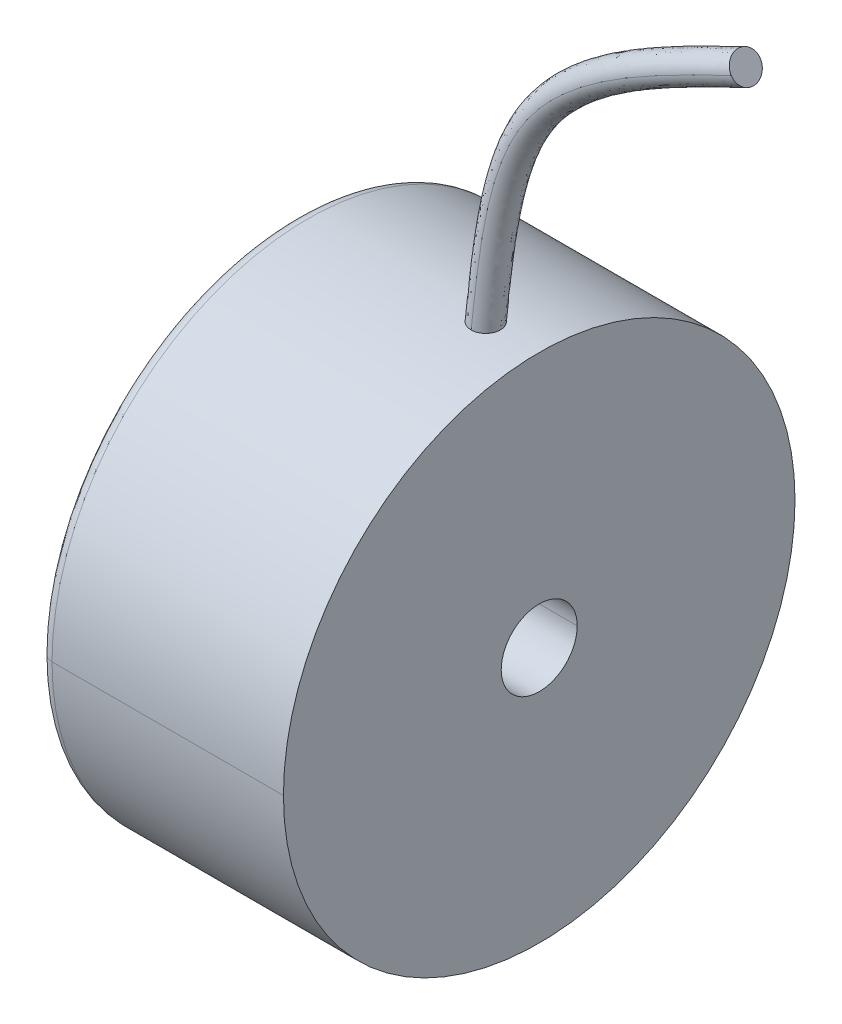
ISO-10303-21;
HEADER;
FILE_DESCRIPTION(('STEP AP214'),'2;1');
FILE_NAME('part.step','',(''),(''),'','','');
FILE_SCHEMA(('AUTOMOTIVE_DESIGN { 1 0 10303 214 1 1 1 1 }'));
ENDSEC;
DATA;
#1=APPLICATION_CONTEXT('core data for automotive mechanical design processes');
#2=APPLICATION_PROTOCOL_DEFINITION('international standard','automotive_design',2000,#1);
#3=PRODUCT_CONTEXT('',#1,'mechanical');
#4=PRODUCT('Part','Part','',(#3));
#5=PRODUCT_RELATED_PRODUCT_CATEGORY('part','',(#4));
#6=PRODUCT_DEFINITION_FORMATION('','',#4);
#7=PRODUCT_DEFINITION_CONTEXT('part definition',#1,'design');
#8=PRODUCT_DEFINITION('design','',#6,#7);
#9=PRODUCT_DEFINITION_SHAPE('','',#8);
#10=(LENGTH_UNIT() NAMED_UNIT(*) SI_UNIT(.MILLI.,.METRE.));
#11=(NAMED_UNIT(*) PLANE_ANGLE_UNIT() SI_UNIT($,.RADIAN.));
#12=(NAMED_UNIT(*) SI_UNIT($,.STERADIAN.) SOLID_ANGLE_UNIT());
#13=UNCERTAINTY_MEASURE_WITH_UNIT(LENGTH_MEASURE(1.E-05),#10,'distance_accuracy_value','');
#14=(GEOMETRIC_REPRESENTATION_CONTEXT(3) GLOBAL_UNCERTAINTY_ASSIGNED_CONTEXT((#13)) GLOBAL_UNIT_ASSIGNED_CONTEXT((#10,
#11,#12)) REPRESENTATION_CONTEXT('',''));
#15=CARTESIAN_POINT('',(0.,0.,0.));
#16=DIRECTION('',(0.,0.,1.));
#17=DIRECTION('',(1.,0.,0.));
#18=AXIS2_PLACEMENT_3D('',#15,#16,#17);
#19=CARTESIAN_POINT('',(7.12405494287447,26.67,-1.524));
#20=DIRECTION('',(0.,-1.,0.));
#21=DIRECTION('',(0.,0.,-1.));
#22=AXIS2_PLACEMENT_3D('',#19,#20,#21);
#23=PLANE('',#22);
#24=CARTESIAN_POINT('',(7.12405494287447,26.67,0.));
#25=DIRECTION('',(0.,1.,0.));
#26=DIRECTION('',(0.,0.,1.));
#27=AXIS2_PLACEMENT_3D('',#24,#25,#26);
#28=CIRCLE('',#27,1.524);
#29=CARTESIAN_POINT('',(7.12405494287447,26.67,1.524));
#30=VERTEX_POINT('',#29);
#31=CARTESIAN_POINT('',(7.12405494287447,26.67,-1.524));
#32=VERTEX_POINT('',#31);
#33=EDGE_CURVE('P0_E66',#30,#32,#28,.T.);
#34=ORIENTED_EDGE('',*,*,#33,.F.);
#35=CARTESIAN_POINT('',(7.12405494287447,26.67,0.));
#36=DIRECTION('',(0.,1.,0.));
#37=DIRECTION('',(0.,0.,1.));
#38=AXIS2_PLACEMENT_3D('',#35,#36,#37);
#39=CIRCLE('',#38,1.524);
#40=EDGE_CURVE('P0_E28',#32,#30,#39,.T.);
#41=ORIENTED_EDGE('',*,*,#40,.F.);
#42=EDGE_LOOP('',(#34,#41));
#43=FACE_BOUND('',#42,.T.);
#44=ADVANCED_FACE('P0_F17',(#43),#23,.T.);
#45=CARTESIAN_POINT('',(34.2383589292058,63.2051769690201,-1.524));
#46=DIRECTION('',(-0.848419505418367,-0.529324421149879,0.));
#47=DIRECTION('',(-0.529324421149879,0.848419505418367,0.));
#48=AXIS2_PLACEMENT_3D('',#45,#46,#47);
#49=PLANE('',#48);
#50=CARTESIAN_POINT('',(34.2383589292058,63.2051769690201,0.));
#51=DIRECTION('',(-0.848419505418367,-0.529324421149878,0.));
#52=DIRECTION('',(0.529324421149878,-0.848419505418367,0.));
#53=AXIS2_PLACEMENT_3D('',#50,#51,#52);
#54=CIRCLE('',#53,1.524);
#55=CARTESIAN_POINT('',(34.2383589292058,63.2051769690201,1.524));
#56=VERTEX_POINT('',#55);
#57=CARTESIAN_POINT('',(34.2383589292058,63.2051769690201,-1.524));
#58=VERTEX_POINT('',#57);
#59=EDGE_CURVE('P0_E11',#56,#58,#54,.T.);
#60=ORIENTED_EDGE('',*,*,#59,.F.);
#61=CARTESIAN_POINT('',(34.2383589292058,63.2051769690201,0.));
#62=DIRECTION('',(-0.848419505418367,-0.529324421149878,0.));
#63=DIRECTION('',(0.529324421149878,-0.848419505418367,0.));
#64=AXIS2_PLACEMENT_3D('',#61,#62,#63);
#65=CIRCLE('',#64,1.524);
#66=EDGE_CURVE('P0_E67',#58,#56,#65,.T.);
#67=ORIENTED_EDGE('',*,*,#66,.F.);
#68=EDGE_LOOP('',(#60,#67));
#69=FACE_BOUND('',#68,.T.);
#70=ADVANCED_FACE('P0_F121',(#69),#49,.F.);
#71=CARTESIAN_POINT('',(7.12405494287447,26.67,-1.524));
#72=CARTESIAN_POINT('',(7.46613984421726,29.8591559967364,-1.524));
#73=CARTESIAN_POINT('',(8.15030964690285,36.2374679902092,-1.524));
#74=CARTESIAN_POINT('',(9.93466656212087,43.1811146241121,-1.524));
#75=CARTESIAN_POINT('',(12.5564109861339,48.2400931976264,-1.524));
#76=CARTESIAN_POINT('',(16.4675259114068,53.0322007632628,-1.524));
#77=CARTESIAN_POINT('',(23.8537860616035,58.1767138295339,-1.524));
#78=CARTESIAN_POINT('',(30.7768346400051,61.5290225891914,-1.524));
#79=CARTESIAN_POINT('',(34.2383589292058,63.2051769690201,-1.524));
#80=CARTESIAN_POINT('',(4.07605494287446,26.67,-1.524));
#81=CARTESIAN_POINT('',(4.41852791464692,29.8956448067599,-1.524));
#82=CARTESIAN_POINT('',(5.10347385819184,36.3469344202797,-1.524));
#83=CARTESIAN_POINT('',(6.91880011572838,43.8721704040474,-1.524));
#84=CARTESIAN_POINT('',(9.84757278436001,49.6325272843674,-1.524));
#85=CARTESIAN_POINT('',(14.2157202709555,55.1860685439759,-1.524));
#86=CARTESIAN_POINT('',(22.1387700976282,60.693612621198,-1.524));
#87=CARTESIAN_POINT('',(29.1295754282368,64.0919772880894,-1.524));
#88=CARTESIAN_POINT('',(32.624978093541,65.7911596215352,-1.524));
#89=CARTESIAN_POINT('',(4.07605494287446,26.67,1.524));
#90=CARTESIAN_POINT('',(4.41852791464692,29.8956448067599,1.524));
#91=CARTESIAN_POINT('',(5.10347385819184,36.3469344202797,1.524));
#92=CARTESIAN_POINT('',(6.91880011572838,43.8721704040474,1.524));
#93=CARTESIAN_POINT('',(9.84757278436001,49.6325272843674,1.524));
#94=CARTESIAN_POINT('',(14.2157202709555,55.1860685439759,1.524));
#95=CARTESIAN_POINT('',(22.1387700976282,60.693612621198,1.524));
#96=CARTESIAN_POINT('',(29.1295754282368,64.0919772880894,1.524));
#97=CARTESIAN_POINT('',(32.624978093541,65.7911596215352,1.524));
#98=CARTESIAN_POINT('',(7.12405494287447,26.67,1.524));
#99=CARTESIAN_POINT('',(7.46613984421726,29.8591559967364,1.524));
#100=CARTESIAN_POINT('',(8.15030964690285,36.2374679902092,1.524));
#101=CARTESIAN_POINT('',(9.93466656212087,43.1811146241121,1.524));
#102=CARTESIAN_POINT('',(12.5564109861339,48.2400931976264,1.524));
#103=CARTESIAN_POINT('',(16.4675259114068,53.0322007632628,1.524));
#104=CARTESIAN_POINT('',(23.8537860616035,58.1767138295339,1.524));
#105=CARTESIAN_POINT('',(30.7768346400051,61.5290225891914,1.524));
#106=CARTESIAN_POINT('',(34.2383589292058,63.2051769690201,1.524));
#107=(BOUNDED_SURFACE() B_SPLINE_SURFACE(3,3,((#71,#72,#73,#74,#75,#76,#77,#78,#79),(#80,#81,
#82,#83,#84,#85,#86,#87,#88),(#89,#90,#91,#92,#93,#94,#95,#96,#97),(#98,#99,#100,#101,#102,#103,
#104,#105,#106)),.UNSPECIFIED.,.F.,.F.,.F.) B_SPLINE_SURFACE_WITH_KNOTS((4,4),(4,1,1,1,1,1,4),
(0.5,1.),(0.,0.186666666666667,0.373333333333334,0.445034723599943,0.56,0.78000000000001,1.),
.UNSPECIFIED.) GEOMETRIC_REPRESENTATION_ITEM() RATIONAL_B_SPLINE_SURFACE(((1.,1.,1.,1.,1.,1.,1.,
1.,1.),(0.333333333333334,0.333333333333334,0.333333333333334,0.333333333333334,
0.333333333333334,0.333333333333334,0.333333333333334,0.333333333333334,0.333333333333334),
(0.333333333333334,0.333333333333334,0.333333333333334,0.333333333333334,0.333333333333334,
0.333333333333334,0.333333333333334,0.333333333333334,0.333333333333334),(1.,1.,1.,1.,1.,1.,1.,
1.,1.))) REPRESENTATION_ITEM('') SURFACE());
#108=CARTESIAN_POINT('',(7.12405494287447,26.67,-1.524));
#109=CARTESIAN_POINT('',(7.46613984421726,29.8591559967364,-1.524));
#110=CARTESIAN_POINT('',(8.15030964690285,36.2374679902092,-1.524));
#111=CARTESIAN_POINT('',(9.93466656212087,43.1811146241121,-1.524));
#112=CARTESIAN_POINT('',(12.5564109861339,48.2400931976264,-1.524));
#113=CARTESIAN_POINT('',(16.4675259114068,53.0322007632628,-1.524));
#114=CARTESIAN_POINT('',(23.8537860616035,58.1767138295339,-1.524));
#115=CARTESIAN_POINT('',(30.7768346400051,61.5290225891914,-1.524));
#116=CARTESIAN_POINT('',(34.2383589292058,63.2051769690201,-1.524));
#117=(BOUNDED_CURVE() B_SPLINE_CURVE(3,(#108,#109,#110,#111,#112,#113,#114,#115,#116),
.UNSPECIFIED.,.F.,.F.) B_SPLINE_CURVE_WITH_KNOTS((4,1,1,1,1,1,4),(0.,0.186666666666667,
0.373333333333334,0.445034723599943,0.56,0.78000000000001,1.),
.UNSPECIFIED.) CURVE() GEOMETRIC_REPRESENTATION_ITEM() RATIONAL_B_SPLINE_CURVE((1.,1.,1.,1.,1.,
1.,1.,1.,1.)) REPRESENTATION_ITEM(''));
#118=EDGE_CURVE('P0_E60',#32,#58,#117,.T.);
#119=CARTESIAN_POINT('',(7.12405494287447,26.67,1.524));
#120=CARTESIAN_POINT('',(7.46613984421726,29.8591559967364,1.524));
#121=CARTESIAN_POINT('',(8.15030964690285,36.2374679902092,1.524));
#122=CARTESIAN_POINT('',(9.93466656212087,43.1811146241121,1.524));
#123=CARTESIAN_POINT('',(12.5564109861339,48.2400931976264,1.524));
#124=CARTESIAN_POINT('',(16.4675259114068,53.0322007632628,1.524));
#125=CARTESIAN_POINT('',(23.8537860616035,58.1767138295339,1.524));
#126=CARTESIAN_POINT('',(30.7768346400051,61.5290225891914,1.524));
#127=CARTESIAN_POINT('',(34.2383589292058,63.2051769690201,1.524));
#128=(BOUNDED_CURVE() B_SPLINE_CURVE(3,(#119,#120,#121,#122,#123,#124,#125,#126,#127),
.UNSPECIFIED.,.F.,.F.) B_SPLINE_CURVE_WITH_KNOTS((4,1,1,1,1,1,4),(0.,0.186666666666667,
0.373333333333334,0.445034723599943,0.56,0.78000000000001,1.),
.UNSPECIFIED.) CURVE() GEOMETRIC_REPRESENTATION_ITEM() RATIONAL_B_SPLINE_CURVE((1.,1.,1.,1.,1.,
1.,1.,1.,1.)) REPRESENTATION_ITEM(''));
#129=EDGE_CURVE('P0_E57',#30,#56,#128,.T.);
#130=ORIENTED_EDGE('',*,*,#118,.F.);
#131=ORIENTED_EDGE('',*,*,#40,.T.);
#132=ORIENTED_EDGE('',*,*,#129,.T.);
#133=ORIENTED_EDGE('',*,*,#59,.T.);
#134=EDGE_LOOP('',(#130,#131,#132,#133));
#135=FACE_BOUND('',#134,.T.);
#136=ADVANCED_FACE('P0_F56',(#135),#107,.T.);
#137=CARTESIAN_POINT('',(7.12405494287447,26.67,1.524));
#138=CARTESIAN_POINT('',(7.46613984421726,29.8591559967364,1.524));
#139=CARTESIAN_POINT('',(8.15030964690285,36.2374679902092,1.524));
#140=CARTESIAN_POINT('',(9.93466656212087,43.1811146241121,1.524));
#141=CARTESIAN_POINT('',(12.5564109861339,48.2400931976264,1.524));
#142=CARTESIAN_POINT('',(16.4675259114068,53.0322007632628,1.524));
#143=CARTESIAN_POINT('',(23.8537860616035,58.1767138295339,1.524));
#144=CARTESIAN_POINT('',(30.7768346400051,61.5290225891914,1.524));
#145=CARTESIAN_POINT('',(34.2383589292058,63.2051769690201,1.524));
#146=CARTESIAN_POINT('',(10.1720549428745,26.67,1.524));
#147=CARTESIAN_POINT('',(10.5137517737876,29.8226671867128,1.524));
#148=CARTESIAN_POINT('',(11.1971454356138,36.1280015601386,1.524));
#149=CARTESIAN_POINT('',(12.9505330085134,42.4900588441769,1.524));
#150=CARTESIAN_POINT('',(15.2652491879078,46.8476591108854,1.524));
#151=CARTESIAN_POINT('',(18.7193315518582,50.8783329825496,1.524));
#152=CARTESIAN_POINT('',(25.5688020255789,55.6598150378698,1.524));
#153=CARTESIAN_POINT('',(32.4240938517735,58.9660678902933,1.524));
#154=CARTESIAN_POINT('',(35.8517397648706,60.6191943165049,1.524));
#155=CARTESIAN_POINT('',(10.1720549428745,26.67,-1.524));
#156=CARTESIAN_POINT('',(10.5137517737876,29.8226671867128,-1.524));
#157=CARTESIAN_POINT('',(11.1971454356138,36.1280015601386,-1.524));
#158=CARTESIAN_POINT('',(12.9505330085134,42.4900588441769,-1.524));
#159=CARTESIAN_POINT('',(15.2652491879078,46.8476591108854,-1.524));
#160=CARTESIAN_POINT('',(18.7193315518582,50.8783329825496,-1.524));
#161=CARTESIAN_POINT('',(25.5688020255789,55.6598150378698,-1.524));
#162=CARTESIAN_POINT('',(32.4240938517735,58.9660678902933,-1.524));
#163=CARTESIAN_POINT('',(35.8517397648706,60.6191943165049,-1.524));
#164=CARTESIAN_POINT('',(7.12405494287447,26.67,-1.524));
#165=CARTESIAN_POINT('',(7.46613984421726,29.8591559967364,-1.524));
#166=CARTESIAN_POINT('',(8.15030964690285,36.2374679902092,-1.524));
#167=CARTESIAN_POINT('',(9.93466656212087,43.1811146241121,-1.524));
#168=CARTESIAN_POINT('',(12.5564109861339,48.2400931976264,-1.524));
#169=CARTESIAN_POINT('',(16.4675259114068,53.0322007632628,-1.524));
#170=CARTESIAN_POINT('',(23.8537860616035,58.1767138295339,-1.524));
#171=CARTESIAN_POINT('',(30.7768346400051,61.5290225891914,-1.524));
#172=CARTESIAN_POINT('',(34.2383589292058,63.2051769690201,-1.524));
#173=(BOUNDED_SURFACE() B_SPLINE_SURFACE(3,3,((#137,#138,#139,#140,#141,#142,#143,#144,#145),
(#146,#147,#148,#149,#150,#151,#152,#153,#154),(#155,#156,#157,#158,#159,#160,#161,#162,#163),
(#164,#165,#166,#167,#168,#169,#170,#171,#172)),.UNSPECIFIED.,.F.,.F.,
.F.) B_SPLINE_SURFACE_WITH_KNOTS((4,4),(4,1,1,1,1,1,4),(0.,0.5),(0.,0.186666666666667,
0.373333333333334,0.445034723599943,0.56,0.78000000000001,1.),
.UNSPECIFIED.) GEOMETRIC_REPRESENTATION_ITEM() RATIONAL_B_SPLINE_SURFACE(((1.,1.,1.,1.,1.,1.,1.,
1.,1.),(0.333333333333334,0.333333333333334,0.333333333333334,0.333333333333334,
0.333333333333334,0.333333333333334,0.333333333333334,0.333333333333334,0.333333333333334),
(0.333333333333334,0.333333333333334,0.333333333333334,0.333333333333334,0.333333333333334,
0.333333333333334,0.333333333333334,0.333333333333334,0.333333333333334),(1.,1.,1.,1.,1.,1.,1.,
1.,1.))) REPRESENTATION_ITEM('') SURFACE());
#174=ORIENTED_EDGE('',*,*,#33,.T.);
#175=ORIENTED_EDGE('',*,*,#118,.T.);
#176=ORIENTED_EDGE('',*,*,#66,.T.);
#177=ORIENTED_EDGE('',*,*,#129,.F.);
#178=EDGE_LOOP('',(#174,#175,#176,#177));
#179=FACE_BOUND('',#178,.T.);
#180=ADVANCED_FACE('P0_F19',(#179),#173,.T.);
#181=CLOSED_SHELL('',(#44,#70,#136,#180));
#182=MANIFOLD_SOLID_BREP('P0_B1',#181);
#183=CARTESIAN_POINT('',(-11.43,0.,0.));
#184=DIRECTION('',(1.,0.,0.));
#185=DIRECTION('',(0.,0.,-1.));
#186=AXIS2_PLACEMENT_3D('',#183,#184,#185);
#187=TOROIDAL_SURFACE('',#186,25.4,1.27);
#188=CARTESIAN_POINT('',(-11.43,0.,25.4));
#189=DIRECTION('',(0.,1.,0.));
#190=DIRECTION('',(0.,0.,1.));
#191=AXIS2_PLACEMENT_3D('',#188,#189,#190);
#192=CIRCLE('',#191,1.27);
#193=CARTESIAN_POINT('',(-12.7,0.,25.4));
#194=VERTEX_POINT('',#193);
#195=CARTESIAN_POINT('',(-11.43,0.,26.67));
#196=VERTEX_POINT('',#195);
#197=EDGE_CURVE('P1_E93',#194,#196,#192,.T.);
#198=ORIENTED_EDGE('',*,*,#197,.F.);
#199=CARTESIAN_POINT('',(-12.7,0.,0.));
#200=DIRECTION('',(-1.,0.,0.));
#201=DIRECTION('',(0.,0.,-1.));
#202=AXIS2_PLACEMENT_3D('',#199,#200,#201);
#203=CIRCLE('',#202,25.4);
#204=CARTESIAN_POINT('',(-12.7,0.,-25.4));
#205=VERTEX_POINT('',#204);
#206=EDGE_CURVE('P1_E26',#205,#194,#203,.T.);
#207=ORIENTED_EDGE('',*,*,#206,.F.);
#208=CARTESIAN_POINT('',(-11.43,0.,-25.4));
#209=DIRECTION('',(0.,-1.,0.));
#210=DIRECTION('',(0.,0.,-1.));
#211=AXIS2_PLACEMENT_3D('',#208,#209,#210);
#212=CIRCLE('',#211,1.27);
#213=CARTESIAN_POINT('',(-11.43,0.,-26.67));
#214=VERTEX_POINT('',#213);
#215=EDGE_CURVE('P1_E100',#205,#214,#212,.T.);
#216=ORIENTED_EDGE('',*,*,#215,.T.);
#217=CARTESIAN_POINT('',(-11.43,0.,0.));
#218=DIRECTION('',(1.,0.,0.));
#219=DIRECTION('',(0.,0.,-1.));
#220=AXIS2_PLACEMENT_3D('',#217,#218,#219);
#221=CIRCLE('',#220,26.67);
#222=EDGE_CURVE('P1_E90',#196,#214,#221,.T.);
#223=ORIENTED_EDGE('',*,*,#222,.F.);
#224=EDGE_LOOP('',(#198,#207,#216,#223));
#225=FACE_BOUND('',#224,.T.);
#226=ADVANCED_FACE('P1_F17',(#225),#187,.T.);
#227=CARTESIAN_POINT('',(-3.048,0.,0.));
#228=DIRECTION('',(1.,0.,0.));
#229=DIRECTION('',(0.,1.,0.));
#230=AXIS2_PLACEMENT_3D('',#227,#228,#229);
#231=PLANE('',#230);
#232=CARTESIAN_POINT('',(-3.048,0.,0.));
#233=DIRECTION('',(1.,0.,0.));
#234=DIRECTION('',(0.,0.,-1.));
#235=AXIS2_PLACEMENT_3D('',#232,#233,#234);
#236=CIRCLE('',#235,3.9624);
#237=CARTESIAN_POINT('',(-3.048,0.,-3.9624));
#238=VERTEX_POINT('',#237);
#239=CARTESIAN_POINT('',(-3.048,0.,3.9624));
#240=VERTEX_POINT('',#239);
#241=EDGE_CURVE('P1_E11',#238,#240,#236,.T.);
#242=ORIENTED_EDGE('',*,*,#241,.T.);
#243=CARTESIAN_POINT('',(-3.048,0.,0.));
#244=DIRECTION('',(1.,0.,0.));
#245=DIRECTION('',(0.,0.,-1.));
#246=AXIS2_PLACEMENT_3D('',#243,#244,#245);
#247=CIRCLE('',#246,3.9624);
#248=EDGE_CURVE('P1_E118',#240,#238,#247,.T.);
#249=ORIENTED_EDGE('',*,*,#248,.T.);
#250=EDGE_LOOP('',(#242,#249));
#251=FACE_BOUND('',#250,.T.);
#252=ADVANCED_FACE('P1_F164',(#251),#231,.T.);
#253=CARTESIAN_POINT('',(-3.048,0.,0.));
#254=DIRECTION('',(1.,0.,0.));
#255=DIRECTION('',(0.,0.,-1.));
#256=AXIS2_PLACEMENT_3D('',#253,#254,#255);
#257=CYLINDRICAL_SURFACE('',#256,3.9624);
#258=DIRECTION('',(1.,0.,0.));
#259=VECTOR('',#258,1.);
#260=CARTESIAN_POINT('',(-3.048,0.,3.9624));
#261=LINE('',#260,#259);
#262=CARTESIAN_POINT('',(12.7,0.,3.9624));
#263=VERTEX_POINT('',#262);
#264=EDGE_CURVE('P1_E124',#240,#263,#261,.T.);
#265=ORIENTED_EDGE('',*,*,#264,.F.);
#266=ORIENTED_EDGE('',*,*,#241,.F.);
#267=DIRECTION('',(1.,0.,0.));
#268=VECTOR('',#267,1.);
#269=CARTESIAN_POINT('',(-3.048,0.,-3.9624));
#270=LINE('',#269,#268);
#271=CARTESIAN_POINT('',(12.7,0.,-3.9624));
#272=VERTEX_POINT('',#271);
#273=EDGE_CURVE('P1_E134',#238,#272,#270,.T.);
#274=ORIENTED_EDGE('',*,*,#273,.T.);
#275=CARTESIAN_POINT('',(12.7,0.,0.));
#276=DIRECTION('',(1.,0.,0.));
#277=DIRECTION('',(0.,0.,-1.));
#278=AXIS2_PLACEMENT_3D('',#275,#276,#277);
#279=CIRCLE('',#278,3.9624);
#280=EDGE_CURVE('P1_E107',#272,#263,#279,.T.);
#281=ORIENTED_EDGE('',*,*,#280,.T.);
#282=EDGE_LOOP('',(#265,#266,#274,#281));
#283=FACE_BOUND('',#282,.T.);
#284=ADVANCED_FACE('P1_F170',(#283),#257,.F.);
#285=CARTESIAN_POINT('',(-12.7,0.,0.));
#286=DIRECTION('',(1.,0.,0.));
#287=DIRECTION('',(0.,1.,0.));
#288=AXIS2_PLACEMENT_3D('',#285,#286,#287);
#289=PLANE('',#288);
#290=ORIENTED_EDGE('',*,*,#206,.T.);
#291=CARTESIAN_POINT('',(-12.7,0.,0.));
#292=DIRECTION('',(-1.,0.,0.));
#293=DIRECTION('',(0.,0.,-1.));
#294=AXIS2_PLACEMENT_3D('',#291,#292,#293);
#295=CIRCLE('',#294,25.4);
#296=EDGE_CURVE('P1_E85',#194,#205,#295,.T.);
#297=ORIENTED_EDGE('',*,*,#296,.T.);
#298=EDGE_LOOP('',(#290,#297));
#299=FACE_BOUND('',#298,.T.);
#300=ADVANCED_FACE('P1_F83',(#299),#289,.F.);
#301=CARTESIAN_POINT('',(-57.4787465940054,0.,0.));
#302=DIRECTION('',(-1.,0.,0.));
#303=DIRECTION('',(0.,0.,1.));
#304=AXIS2_PLACEMENT_3D('',#301,#302,#303);
#305=CYLINDRICAL_SURFACE('',#304,26.67);
#306=DIRECTION('',(-1.,0.,0.));
#307=VECTOR('',#306,1.);
#308=CARTESIAN_POINT('',(-57.4787465940054,0.,-26.67));
#309=LINE('',#308,#307);
#310=CARTESIAN_POINT('',(12.7,0.,-26.67));
#311=VERTEX_POINT('',#310);
#312=EDGE_CURVE('P1_E112',#311,#214,#309,.T.);
#313=ORIENTED_EDGE('',*,*,#312,.F.);
#314=CARTESIAN_POINT('',(12.7,0.,0.));
#315=DIRECTION('',(-1.,0.,0.));
#316=DIRECTION('',(0.,0.,1.));
#317=AXIS2_PLACEMENT_3D('',#314,#315,#316);
#318=CIRCLE('',#317,26.67);
#319=CARTESIAN_POINT('',(12.7,0.,26.67));
#320=VERTEX_POINT('',#319);
#321=EDGE_CURVE('P1_E39',#311,#320,#318,.T.);
#322=ORIENTED_EDGE('',*,*,#321,.T.);
#323=DIRECTION('',(-1.,0.,0.));
#324=VECTOR('',#323,1.);
#325=CARTESIAN_POINT('',(-57.4787465940054,0.,26.67));
#326=LINE('',#325,#324);
#327=EDGE_CURVE('P1_E109',#320,#196,#326,.T.);
#328=ORIENTED_EDGE('',*,*,#327,.T.);
#329=ORIENTED_EDGE('',*,*,#222,.T.);
#330=EDGE_LOOP('',(#313,#322,#328,#329));
#331=FACE_BOUND('',#330,.T.);
#332=ADVANCED_FACE('P1_F150',(#331),#305,.T.);
#333=CARTESIAN_POINT('',(12.7,26.67,0.));
#334=DIRECTION('',(-1.,0.,0.));
#335=DIRECTION('',(0.,0.,1.));
#336=AXIS2_PLACEMENT_3D('',#333,#334,#335);
#337=PLANE('',#336);
#338=ORIENTED_EDGE('',*,*,#280,.F.);
#339=CARTESIAN_POINT('',(12.7,0.,0.));
#340=DIRECTION('',(1.,0.,0.));
#341=DIRECTION('',(0.,0.,-1.));
#342=AXIS2_PLACEMENT_3D('',#339,#340,#341);
#343=CIRCLE('',#342,3.9624);
#344=EDGE_CURVE('P1_E128',#263,#272,#343,.T.);
#345=ORIENTED_EDGE('',*,*,#344,.F.);
#346=EDGE_LOOP('',(#338,#345));
#347=FACE_BOUND('',#346,.T.);
#348=CARTESIAN_POINT('',(12.7,0.,0.));
#349=DIRECTION('',(-1.,0.,0.));
#350=DIRECTION('',(0.,0.,1.));
#351=AXIS2_PLACEMENT_3D('',#348,#349,#350);
#352=CIRCLE('',#351,26.67);
#353=EDGE_CURVE('P1_E20',#320,#311,#352,.T.);
#354=ORIENTED_EDGE('',*,*,#353,.F.);
#355=ORIENTED_EDGE('',*,*,#321,.F.);
#356=EDGE_LOOP('',(#354,#355));
#357=FACE_BOUND('',#356,.T.);
#358=ADVANCED_FACE('P1_F148',(#347,#357),#337,.F.);
#359=CARTESIAN_POINT('',(-57.4787465940054,0.,0.));
#360=DIRECTION('',(-1.,0.,0.));
#361=DIRECTION('',(0.,0.,1.));
#362=AXIS2_PLACEMENT_3D('',#359,#360,#361);
#363=CYLINDRICAL_SURFACE('',#362,26.67);
#364=ORIENTED_EDGE('',*,*,#353,.T.);
#365=ORIENTED_EDGE('',*,*,#312,.T.);
#366=CARTESIAN_POINT('',(-11.43,0.,0.));
#367=DIRECTION('',(1.,0.,0.));
#368=DIRECTION('',(0.,0.,-1.));
#369=AXIS2_PLACEMENT_3D('',#366,#367,#368);
#370=CIRCLE('',#369,26.67);
#371=EDGE_CURVE('P1_E97',#214,#196,#370,.T.);
#372=ORIENTED_EDGE('',*,*,#371,.T.);
#373=ORIENTED_EDGE('',*,*,#327,.F.);
#374=EDGE_LOOP('',(#364,#365,#372,#373));
#375=FACE_BOUND('',#374,.T.);
#376=ADVANCED_FACE('P1_F147',(#375),#363,.T.);
#377=CARTESIAN_POINT('',(-3.048,0.,0.));
#378=DIRECTION('',(1.,0.,0.));
#379=DIRECTION('',(0.,0.,-1.));
#380=AXIS2_PLACEMENT_3D('',#377,#378,#379);
#381=CYLINDRICAL_SURFACE('',#380,3.9624);
#382=ORIENTED_EDGE('',*,*,#248,.F.);
#383=ORIENTED_EDGE('',*,*,#264,.T.);
#384=ORIENTED_EDGE('',*,*,#344,.T.);
#385=ORIENTED_EDGE('',*,*,#273,.F.);
#386=EDGE_LOOP('',(#382,#383,#384,#385));
#387=FACE_BOUND('',#386,.T.);
#388=ADVANCED_FACE('P1_F159',(#387),#381,.F.);
#389=CARTESIAN_POINT('',(-11.43,0.,0.));
#390=DIRECTION('',(1.,0.,0.));
#391=DIRECTION('',(0.,0.,-1.));
#392=AXIS2_PLACEMENT_3D('',#389,#390,#391);
#393=TOROIDAL_SURFACE('',#392,25.4,1.27);
#394=ORIENTED_EDGE('',*,*,#296,.F.);
#395=ORIENTED_EDGE('',*,*,#197,.T.);
#396=ORIENTED_EDGE('',*,*,#371,.F.);
#397=ORIENTED_EDGE('',*,*,#215,.F.);
#398=EDGE_LOOP('',(#394,#395,#396,#397));
#399=FACE_BOUND('',#398,.T.);
#400=ADVANCED_FACE('P1_F99',(#399),#393,.T.);
#401=CLOSED_SHELL('',(#226,#252,#284,#300,#332,#358,#376,#388,#400));
#402=MANIFOLD_SOLID_BREP('P1_B1',#401);
#403=ADVANCED_BREP_SHAPE_REPRESENTATION('',(#18,#182,#402),#14);
#404=SHAPE_DEFINITION_REPRESENTATION(#9,#403);
ENDSEC;
END-ISO-10303-21;
